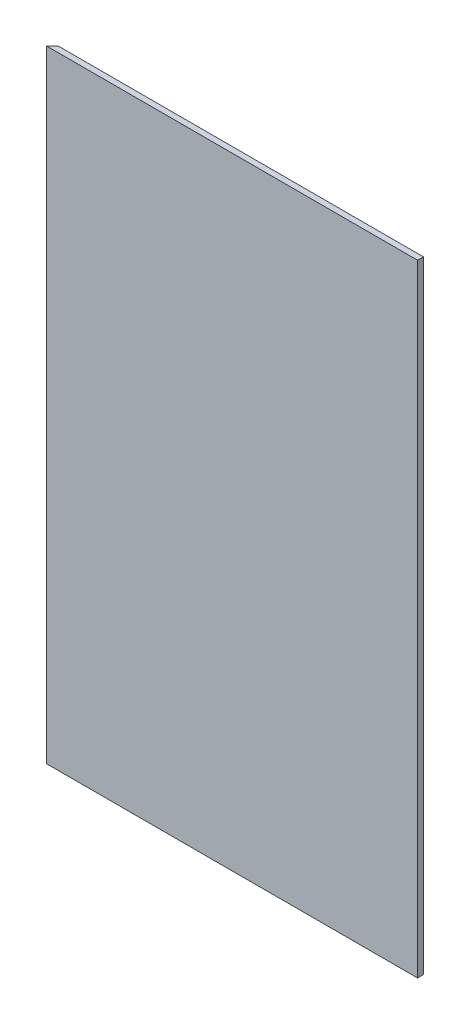
ISO-10303-21;
HEADER;
FILE_DESCRIPTION(('STEP AP214'),'2;1');
FILE_NAME('part.step','',(''),(''),'','','');
FILE_SCHEMA(('AUTOMOTIVE_DESIGN { 1 0 10303 214 1 1 1 1 }'));
ENDSEC;
DATA;
#1=APPLICATION_CONTEXT('core data for automotive mechanical design processes');
#2=APPLICATION_PROTOCOL_DEFINITION('international standard','automotive_design',2000,#1);
#3=PRODUCT_CONTEXT('',#1,'mechanical');
#4=PRODUCT('Part','Part','',(#3));
#5=PRODUCT_RELATED_PRODUCT_CATEGORY('part','',(#4));
#6=PRODUCT_DEFINITION_FORMATION('','',#4);
#7=PRODUCT_DEFINITION_CONTEXT('part definition',#1,'design');
#8=PRODUCT_DEFINITION('design','',#6,#7);
#9=PRODUCT_DEFINITION_SHAPE('','',#8);
#10=(LENGTH_UNIT() NAMED_UNIT(*) SI_UNIT(.MILLI.,.METRE.));
#11=(NAMED_UNIT(*) PLANE_ANGLE_UNIT() SI_UNIT($,.RADIAN.));
#12=(NAMED_UNIT(*) SI_UNIT($,.STERADIAN.) SOLID_ANGLE_UNIT());
#13=UNCERTAINTY_MEASURE_WITH_UNIT(LENGTH_MEASURE(1.E-05),#10,'distance_accuracy_value','');
#14=(GEOMETRIC_REPRESENTATION_CONTEXT(3) GLOBAL_UNCERTAINTY_ASSIGNED_CONTEXT((#13)) GLOBAL_UNIT_ASSIGNED_CONTEXT((#10,
#11,#12)) REPRESENTATION_CONTEXT('',''));
#15=CARTESIAN_POINT('',(0.,0.,0.));
#16=DIRECTION('',(0.,0.,1.));
#17=DIRECTION('',(1.,0.,0.));
#18=AXIS2_PLACEMENT_3D('',#15,#16,#17);
#19=CARTESIAN_POINT('',(95.5,160.,3.));
#20=DIRECTION('',(-1.,0.,0.));
#21=DIRECTION('',(0.,-1.,0.));
#22=AXIS2_PLACEMENT_3D('',#19,#20,#21);
#23=PLANE('',#22);
#24=DIRECTION('',(0.,1.,0.));
#25=VECTOR('',#24,1.);
#26=CARTESIAN_POINT('',(95.5,160.,0.));
#27=LINE('',#26,#25);
#28=CARTESIAN_POINT('',(95.5,-160.,0.));
#29=VERTEX_POINT('',#28);
#30=CARTESIAN_POINT('',(95.5,160.,0.));
#31=VERTEX_POINT('',#30);
#32=EDGE_CURVE('E86',#29,#31,#27,.T.);
#33=ORIENTED_EDGE('',*,*,#32,.T.);
#34=DIRECTION('',(0.,0.,-1.));
#35=VECTOR('',#34,1.);
#36=CARTESIAN_POINT('',(95.5,160.,3.));
#37=LINE('',#36,#35);
#38=CARTESIAN_POINT('',(95.5,160.,3.));
#39=VERTEX_POINT('',#38);
#40=EDGE_CURVE('E11',#39,#31,#37,.T.);
#41=ORIENTED_EDGE('',*,*,#40,.F.);
#42=DIRECTION('',(0.,1.,0.));
#43=VECTOR('',#42,1.);
#44=CARTESIAN_POINT('',(95.5,160.,3.));
#45=LINE('',#44,#43);
#46=CARTESIAN_POINT('',(95.5,-160.,3.));
#47=VERTEX_POINT('',#46);
#48=EDGE_CURVE('E80',#47,#39,#45,.T.);
#49=ORIENTED_EDGE('',*,*,#48,.F.);
#50=DIRECTION('',(0.,0.,-1.));
#51=VECTOR('',#50,1.);
#52=CARTESIAN_POINT('',(95.5,-160.,3.));
#53=LINE('',#52,#51);
#54=EDGE_CURVE('E41',#47,#29,#53,.T.);
#55=ORIENTED_EDGE('',*,*,#54,.T.);
#56=EDGE_LOOP('',(#33,#41,#49,#55));
#57=FACE_BOUND('',#56,.T.);
#58=ADVANCED_FACE('F34',(#57),#23,.F.);
#59=CARTESIAN_POINT('',(-95.5,160.,3.));
#60=DIRECTION('',(0.,-1.,0.));
#61=DIRECTION('',(0.,0.,-1.));
#62=AXIS2_PLACEMENT_3D('',#59,#60,#61);
#63=PLANE('',#62);
#64=DIRECTION('',(-1.,0.,0.));
#65=VECTOR('',#64,1.);
#66=CARTESIAN_POINT('',(-95.5,160.,0.));
#67=LINE('',#66,#65);
#68=CARTESIAN_POINT('',(-92.5,160.,0.));
#69=VERTEX_POINT('',#68);
#70=EDGE_CURVE('E81',#31,#69,#67,.T.);
#71=ORIENTED_EDGE('',*,*,#70,.T.);
#72=DIRECTION('',(0.707106781186548,0.,-0.707106781186547));
#73=VECTOR('',#72,1.);
#74=CARTESIAN_POINT('',(-92.5,160.,0.));
#75=LINE('',#74,#73);
#76=CARTESIAN_POINT('',(-95.5,160.,3.));
#77=VERTEX_POINT('',#76);
#78=EDGE_CURVE('E48',#77,#69,#75,.T.);
#79=ORIENTED_EDGE('',*,*,#78,.F.);
#80=DIRECTION('',(-1.,0.,0.));
#81=VECTOR('',#80,1.);
#82=CARTESIAN_POINT('',(-95.5,160.,3.));
#83=LINE('',#82,#81);
#84=EDGE_CURVE('E97',#39,#77,#83,.T.);
#85=ORIENTED_EDGE('',*,*,#84,.F.);
#86=ORIENTED_EDGE('',*,*,#40,.T.);
#87=EDGE_LOOP('',(#71,#79,#85,#86));
#88=FACE_BOUND('',#87,.T.);
#89=ADVANCED_FACE('F105',(#88),#63,.F.);
#90=CARTESIAN_POINT('',(-95.5,-160.,3.));
#91=DIRECTION('',(0.,1.,0.));
#92=DIRECTION('',(0.,0.,1.));
#93=AXIS2_PLACEMENT_3D('',#90,#91,#92);
#94=PLANE('',#93);
#95=DIRECTION('',(1.,0.,0.));
#96=VECTOR('',#95,1.);
#97=CARTESIAN_POINT('',(-95.5,-160.,3.));
#98=LINE('',#97,#96);
#99=CARTESIAN_POINT('',(-95.5,-160.,3.));
#100=VERTEX_POINT('',#99);
#101=EDGE_CURVE('E57',#100,#47,#98,.T.);
#102=ORIENTED_EDGE('',*,*,#101,.F.);
#103=DIRECTION('',(0.707106781186548,0.,-0.707106781186547));
#104=VECTOR('',#103,1.);
#105=CARTESIAN_POINT('',(-92.5,-160.,0.));
#106=LINE('',#105,#104);
#107=CARTESIAN_POINT('',(-92.5,-160.,0.));
#108=VERTEX_POINT('',#107);
#109=EDGE_CURVE('E77',#100,#108,#106,.T.);
#110=ORIENTED_EDGE('',*,*,#109,.T.);
#111=DIRECTION('',(1.,0.,0.));
#112=VECTOR('',#111,1.);
#113=CARTESIAN_POINT('',(-95.5,-160.,0.));
#114=LINE('',#113,#112);
#115=EDGE_CURVE('E71',#108,#29,#114,.T.);
#116=ORIENTED_EDGE('',*,*,#115,.T.);
#117=ORIENTED_EDGE('',*,*,#54,.F.);
#118=EDGE_LOOP('',(#102,#110,#116,#117));
#119=FACE_BOUND('',#118,.T.);
#120=ADVANCED_FACE('F73',(#119),#94,.F.);
#121=CARTESIAN_POINT('',(0.,0.,3.));
#122=DIRECTION('',(0.,0.,1.));
#123=DIRECTION('',(1.,0.,0.));
#124=AXIS2_PLACEMENT_3D('',#121,#122,#123);
#125=PLANE('',#124);
#126=ORIENTED_EDGE('',*,*,#48,.T.);
#127=ORIENTED_EDGE('',*,*,#84,.T.);
#128=DIRECTION('',(0.,-1.,0.));
#129=VECTOR('',#128,1.);
#130=CARTESIAN_POINT('',(-95.5,160.,3.));
#131=LINE('',#130,#129);
#132=EDGE_CURVE('E95',#77,#100,#131,.T.);
#133=ORIENTED_EDGE('',*,*,#132,.T.);
#134=ORIENTED_EDGE('',*,*,#101,.T.);
#135=EDGE_LOOP('',(#126,#127,#133,#134));
#136=FACE_BOUND('',#135,.T.);
#137=ADVANCED_FACE('F102',(#136),#125,.T.);
#138=CARTESIAN_POINT('',(0.,0.,0.));
#139=DIRECTION('',(0.,0.,1.));
#140=DIRECTION('',(1.,0.,0.));
#141=AXIS2_PLACEMENT_3D('',#138,#139,#140);
#142=PLANE('',#141);
#143=ORIENTED_EDGE('',*,*,#115,.F.);
#144=DIRECTION('',(0.,1.,0.));
#145=VECTOR('',#144,1.);
#146=CARTESIAN_POINT('',(-92.5,-160.,0.));
#147=LINE('',#146,#145);
#148=EDGE_CURVE('E89',#108,#69,#147,.T.);
#149=ORIENTED_EDGE('',*,*,#148,.T.);
#150=ORIENTED_EDGE('',*,*,#70,.F.);
#151=ORIENTED_EDGE('',*,*,#32,.F.);
#152=EDGE_LOOP('',(#143,#149,#150,#151));
#153=FACE_BOUND('',#152,.T.);
#154=ADVANCED_FACE('F87',(#153),#142,.F.);
#155=CARTESIAN_POINT('',(-92.5,-160.,0.));
#156=DIRECTION('',(0.707106781186547,0.,0.707106781186548));
#157=DIRECTION('',(0.707106781186548,0.,-0.707106781186547));
#158=AXIS2_PLACEMENT_3D('',#155,#156,#157);
#159=PLANE('',#158);
#160=ORIENTED_EDGE('',*,*,#78,.T.);
#161=ORIENTED_EDGE('',*,*,#148,.F.);
#162=ORIENTED_EDGE('',*,*,#109,.F.);
#163=ORIENTED_EDGE('',*,*,#132,.F.);
#164=EDGE_LOOP('',(#160,#161,#162,#163));
#165=FACE_BOUND('',#164,.T.);
#166=ADVANCED_FACE('F108',(#165),#159,.F.);
#167=CLOSED_SHELL('',(#58,#89,#120,#137,#154,#166));
#168=MANIFOLD_SOLID_BREP('B2',#167);
#169=ADVANCED_BREP_SHAPE_REPRESENTATION('',(#18,#168),#14);
#170=SHAPE_DEFINITION_REPRESENTATION(#9,#169);
ENDSEC;
END-ISO-10303-21;
